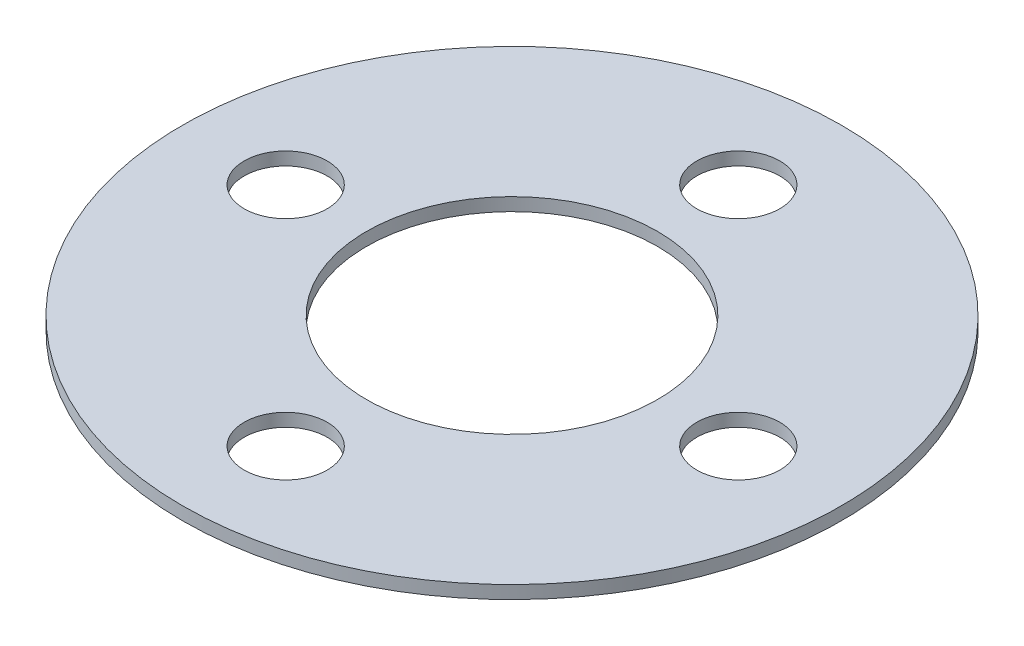
ISO-10303-21;
HEADER;
FILE_DESCRIPTION(('STEP AP214'),'2;1');
FILE_NAME('part.step','',(''),(''),'','','');
FILE_SCHEMA(('AUTOMOTIVE_DESIGN { 1 0 10303 214 1 1 1 1 }'));
ENDSEC;
DATA;
#1=APPLICATION_CONTEXT('core data for automotive mechanical design processes');
#2=APPLICATION_PROTOCOL_DEFINITION('international standard','automotive_design',2000,#1);
#3=PRODUCT_CONTEXT('',#1,'mechanical');
#4=PRODUCT('Part','Part','',(#3));
#5=PRODUCT_RELATED_PRODUCT_CATEGORY('part','',(#4));
#6=PRODUCT_DEFINITION_FORMATION('','',#4);
#7=PRODUCT_DEFINITION_CONTEXT('part definition',#1,'design');
#8=PRODUCT_DEFINITION('design','',#6,#7);
#9=PRODUCT_DEFINITION_SHAPE('','',#8);
#10=(LENGTH_UNIT() NAMED_UNIT(*) SI_UNIT(.MILLI.,.METRE.));
#11=(NAMED_UNIT(*) PLANE_ANGLE_UNIT() SI_UNIT($,.RADIAN.));
#12=(NAMED_UNIT(*) SI_UNIT($,.STERADIAN.) SOLID_ANGLE_UNIT());
#13=UNCERTAINTY_MEASURE_WITH_UNIT(LENGTH_MEASURE(1.E-05),#10,'distance_accuracy_value','');
#14=(GEOMETRIC_REPRESENTATION_CONTEXT(3) GLOBAL_UNCERTAINTY_ASSIGNED_CONTEXT((#13)) GLOBAL_UNIT_ASSIGNED_CONTEXT((#10,
#11,#12)) REPRESENTATION_CONTEXT('',''));
#15=CARTESIAN_POINT('',(0.,0.,0.));
#16=DIRECTION('',(0.,0.,1.));
#17=DIRECTION('',(1.,0.,0.));
#18=AXIS2_PLACEMENT_3D('',#15,#16,#17);
#19=CARTESIAN_POINT('',(0.,0.8636,0.));
#20=DIRECTION('',(0.,1.,0.));
#21=DIRECTION('',(0.,0.,1.));
#22=AXIS2_PLACEMENT_3D('',#19,#20,#21);
#23=PLANE('',#22);
#24=CARTESIAN_POINT('',(0.,0.8636,0.));
#25=DIRECTION('',(0.,-1.,0.));
#26=DIRECTION('',(0.,0.,-1.));
#27=AXIS2_PLACEMENT_3D('',#24,#25,#26);
#28=CIRCLE('',#27,9.652);
#29=CARTESIAN_POINT('',(0.,0.8636,-9.652));
#30=VERTEX_POINT('',#29);
#31=EDGE_CURVE('E83',#30,#30,#28,.T.);
#32=ORIENTED_EDGE('',*,*,#31,.T.);
#33=EDGE_LOOP('',(#32));
#34=FACE_BOUND('',#33,.T.);
#35=CARTESIAN_POINT('',(8.47140372315957E-13,0.8636,15.));
#36=DIRECTION('',(0.,1.,0.));
#37=DIRECTION('',(0.,0.,1.));
#38=AXIS2_PLACEMENT_3D('',#35,#36,#37);
#39=CIRCLE('',#38,2.75000000000091);
#40=CARTESIAN_POINT('',(8.47140372315957E-13,0.8636,17.7500000000009));
#41=VERTEX_POINT('',#40);
#42=EDGE_CURVE('E67',#41,#41,#39,.T.);
#43=ORIENTED_EDGE('',*,*,#42,.F.);
#44=EDGE_LOOP('',(#43));
#45=FACE_BOUND('',#44,.T.);
#46=CARTESIAN_POINT('',(0.,0.8636,-15.));
#47=DIRECTION('',(0.,1.,0.));
#48=DIRECTION('',(0.,0.,1.));
#49=AXIS2_PLACEMENT_3D('',#46,#47,#48);
#50=CIRCLE('',#49,2.75);
#51=CARTESIAN_POINT('',(0.,0.8636,-12.25));
#52=VERTEX_POINT('',#51);
#53=EDGE_CURVE('E53',#52,#52,#50,.T.);
#54=ORIENTED_EDGE('',*,*,#53,.F.);
#55=EDGE_LOOP('',(#54));
#56=FACE_BOUND('',#55,.T.);
#57=CARTESIAN_POINT('',(0.,0.8636,0.));
#58=DIRECTION('',(0.,1.,0.));
#59=DIRECTION('',(0.,0.,1.));
#60=AXIS2_PLACEMENT_3D('',#57,#58,#59);
#61=CIRCLE('',#60,21.844);
#62=CARTESIAN_POINT('',(0.,0.8636,21.844));
#63=VERTEX_POINT('',#62);
#64=EDGE_CURVE('E10',#63,#63,#61,.T.);
#65=ORIENTED_EDGE('',*,*,#64,.T.);
#66=EDGE_LOOP('',(#65));
#67=FACE_BOUND('',#66,.T.);
#68=CARTESIAN_POINT('',(15.0000000000004,0.8636,-4.23570186157979E-13));
#69=DIRECTION('',(0.,1.,0.));
#70=DIRECTION('',(0.,0.,1.));
#71=AXIS2_PLACEMENT_3D('',#68,#69,#70);
#72=CIRCLE('',#71,2.75000000000033);
#73=CARTESIAN_POINT('',(15.0000000000004,0.8636,2.74999999999991));
#74=VERTEX_POINT('',#73);
#75=EDGE_CURVE('E59',#74,#74,#72,.T.);
#76=ORIENTED_EDGE('',*,*,#75,.F.);
#77=EDGE_LOOP('',(#76));
#78=FACE_BOUND('',#77,.T.);
#79=CARTESIAN_POINT('',(-14.9999999999996,0.8636,4.254071563567E-13));
#80=DIRECTION('',(0.,1.,0.));
#81=DIRECTION('',(0.,0.,1.));
#82=AXIS2_PLACEMENT_3D('',#79,#80,#81);
#83=CIRCLE('',#82,2.75000000000068);
#84=CARTESIAN_POINT('',(-14.9999999999996,0.8636,2.75000000000111));
#85=VERTEX_POINT('',#84);
#86=EDGE_CURVE('E75',#85,#85,#83,.T.);
#87=ORIENTED_EDGE('',*,*,#86,.F.);
#88=EDGE_LOOP('',(#87));
#89=FACE_BOUND('',#88,.T.);
#90=ADVANCED_FACE('F40',(#34,#45,#56,#67,#78,#89),#23,.T.);
#91=CARTESIAN_POINT('',(0.,0.,0.));
#92=DIRECTION('',(0.,1.,0.));
#93=DIRECTION('',(0.,0.,1.));
#94=AXIS2_PLACEMENT_3D('',#91,#92,#93);
#95=PLANE('',#94);
#96=CARTESIAN_POINT('',(0.,0.,0.));
#97=DIRECTION('',(0.,-1.,0.));
#98=DIRECTION('',(0.,0.,-1.));
#99=AXIS2_PLACEMENT_3D('',#96,#97,#98);
#100=CIRCLE('',#99,9.652);
#101=CARTESIAN_POINT('',(0.,0.,-9.652));
#102=VERTEX_POINT('',#101);
#103=EDGE_CURVE('E87',#102,#102,#100,.T.);
#104=ORIENTED_EDGE('',*,*,#103,.F.);
#105=EDGE_LOOP('',(#104));
#106=FACE_BOUND('',#105,.T.);
#107=CARTESIAN_POINT('',(0.,0.,0.));
#108=DIRECTION('',(0.,1.,0.));
#109=DIRECTION('',(0.,0.,1.));
#110=AXIS2_PLACEMENT_3D('',#107,#108,#109);
#111=CIRCLE('',#110,21.844);
#112=CARTESIAN_POINT('',(0.,0.,21.844));
#113=VERTEX_POINT('',#112);
#114=EDGE_CURVE('E44',#113,#113,#111,.T.);
#115=ORIENTED_EDGE('',*,*,#114,.F.);
#116=EDGE_LOOP('',(#115));
#117=FACE_BOUND('',#116,.T.);
#118=CARTESIAN_POINT('',(0.,0.,-15.));
#119=DIRECTION('',(0.,1.,0.));
#120=DIRECTION('',(0.,0.,1.));
#121=AXIS2_PLACEMENT_3D('',#118,#119,#120);
#122=CIRCLE('',#121,2.75);
#123=CARTESIAN_POINT('',(0.,0.,-12.25));
#124=VERTEX_POINT('',#123);
#125=EDGE_CURVE('E55',#124,#124,#122,.T.);
#126=ORIENTED_EDGE('',*,*,#125,.T.);
#127=EDGE_LOOP('',(#126));
#128=FACE_BOUND('',#127,.T.);
#129=CARTESIAN_POINT('',(15.0000000000004,0.,-4.23570186157979E-13));
#130=DIRECTION('',(0.,1.,0.));
#131=DIRECTION('',(0.,0.,1.));
#132=AXIS2_PLACEMENT_3D('',#129,#130,#131);
#133=CIRCLE('',#132,2.75000000000033);
#134=CARTESIAN_POINT('',(15.0000000000004,0.,2.74999999999991));
#135=VERTEX_POINT('',#134);
#136=EDGE_CURVE('E63',#135,#135,#133,.T.);
#137=ORIENTED_EDGE('',*,*,#136,.T.);
#138=EDGE_LOOP('',(#137));
#139=FACE_BOUND('',#138,.T.);
#140=CARTESIAN_POINT('',(8.47140372315957E-13,0.,15.));
#141=DIRECTION('',(0.,1.,0.));
#142=DIRECTION('',(0.,0.,1.));
#143=AXIS2_PLACEMENT_3D('',#140,#141,#142);
#144=CIRCLE('',#143,2.75000000000091);
#145=CARTESIAN_POINT('',(8.47140372315957E-13,0.,17.7500000000009));
#146=VERTEX_POINT('',#145);
#147=EDGE_CURVE('E71',#146,#146,#144,.T.);
#148=ORIENTED_EDGE('',*,*,#147,.T.);
#149=EDGE_LOOP('',(#148));
#150=FACE_BOUND('',#149,.T.);
#151=CARTESIAN_POINT('',(-14.9999999999996,0.,4.254071563567E-13));
#152=DIRECTION('',(0.,1.,0.));
#153=DIRECTION('',(0.,0.,1.));
#154=AXIS2_PLACEMENT_3D('',#151,#152,#153);
#155=CIRCLE('',#154,2.75000000000068);
#156=CARTESIAN_POINT('',(-14.9999999999996,0.,2.75000000000111));
#157=VERTEX_POINT('',#156);
#158=EDGE_CURVE('E79',#157,#157,#155,.T.);
#159=ORIENTED_EDGE('',*,*,#158,.T.);
#160=EDGE_LOOP('',(#159));
#161=FACE_BOUND('',#160,.T.);
#162=ADVANCED_FACE('F104',(#106,#117,#128,#139,#150,#161),#95,.F.);
#163=CARTESIAN_POINT('',(0.,0.8636,0.));
#164=DIRECTION('',(0.,-1.,0.));
#165=DIRECTION('',(0.,0.,-1.));
#166=AXIS2_PLACEMENT_3D('',#163,#164,#165);
#167=CYLINDRICAL_SURFACE('',#166,21.844);
#168=ORIENTED_EDGE('',*,*,#64,.F.);
#169=EDGE_LOOP('',(#168));
#170=FACE_BOUND('',#169,.T.);
#171=ORIENTED_EDGE('',*,*,#114,.T.);
#172=EDGE_LOOP('',(#171));
#173=FACE_BOUND('',#172,.T.);
#174=ADVANCED_FACE('F42',(#170,#173),#167,.T.);
#175=CARTESIAN_POINT('',(0.,0.8636,-15.));
#176=DIRECTION('',(0.,-1.,0.));
#177=DIRECTION('',(0.,0.,-1.));
#178=AXIS2_PLACEMENT_3D('',#175,#176,#177);
#179=CYLINDRICAL_SURFACE('',#178,2.75);
#180=ORIENTED_EDGE('',*,*,#53,.T.);
#181=EDGE_LOOP('',(#180));
#182=FACE_BOUND('',#181,.T.);
#183=ORIENTED_EDGE('',*,*,#125,.F.);
#184=EDGE_LOOP('',(#183));
#185=FACE_BOUND('',#184,.T.);
#186=ADVANCED_FACE('F132',(#182,#185),#179,.F.);
#187=CARTESIAN_POINT('',(15.0000000000004,0.8636,-4.23570186157979E-13));
#188=DIRECTION('',(0.,-1.,0.));
#189=DIRECTION('',(0.,0.,-1.));
#190=AXIS2_PLACEMENT_3D('',#187,#188,#189);
#191=CYLINDRICAL_SURFACE('',#190,2.75000000000033);
#192=ORIENTED_EDGE('',*,*,#75,.T.);
#193=EDGE_LOOP('',(#192));
#194=FACE_BOUND('',#193,.T.);
#195=ORIENTED_EDGE('',*,*,#136,.F.);
#196=EDGE_LOOP('',(#195));
#197=FACE_BOUND('',#196,.T.);
#198=ADVANCED_FACE('F124',(#194,#197),#191,.F.);
#199=CARTESIAN_POINT('',(8.47140372315957E-13,0.8636,15.));
#200=DIRECTION('',(0.,-1.,0.));
#201=DIRECTION('',(0.,0.,-1.));
#202=AXIS2_PLACEMENT_3D('',#199,#200,#201);
#203=CYLINDRICAL_SURFACE('',#202,2.75000000000091);
#204=ORIENTED_EDGE('',*,*,#42,.T.);
#205=EDGE_LOOP('',(#204));
#206=FACE_BOUND('',#205,.T.);
#207=ORIENTED_EDGE('',*,*,#147,.F.);
#208=EDGE_LOOP('',(#207));
#209=FACE_BOUND('',#208,.T.);
#210=ADVANCED_FACE('F118',(#206,#209),#203,.F.);
#211=CARTESIAN_POINT('',(-14.9999999999996,0.8636,4.254071563567E-13));
#212=DIRECTION('',(0.,-1.,0.));
#213=DIRECTION('',(0.,0.,-1.));
#214=AXIS2_PLACEMENT_3D('',#211,#212,#213);
#215=CYLINDRICAL_SURFACE('',#214,2.75000000000068);
#216=ORIENTED_EDGE('',*,*,#86,.T.);
#217=EDGE_LOOP('',(#216));
#218=FACE_BOUND('',#217,.T.);
#219=ORIENTED_EDGE('',*,*,#158,.F.);
#220=EDGE_LOOP('',(#219));
#221=FACE_BOUND('',#220,.T.);
#222=ADVANCED_FACE('F100',(#218,#221),#215,.F.);
#223=CARTESIAN_POINT('',(0.,0.8636,0.));
#224=DIRECTION('',(0.,-1.,0.));
#225=DIRECTION('',(0.,0.,-1.));
#226=AXIS2_PLACEMENT_3D('',#223,#224,#225);
#227=CYLINDRICAL_SURFACE('',#226,9.652);
#228=ORIENTED_EDGE('',*,*,#31,.F.);
#229=EDGE_LOOP('',(#228));
#230=FACE_BOUND('',#229,.T.);
#231=ORIENTED_EDGE('',*,*,#103,.T.);
#232=EDGE_LOOP('',(#231));
#233=FACE_BOUND('',#232,.T.);
#234=ADVANCED_FACE('F97',(#230,#233),#227,.F.);
#235=CLOSED_SHELL('',(#90,#162,#174,#186,#198,#210,#222,#234));
#236=MANIFOLD_SOLID_BREP('B2',#235);
#237=ADVANCED_BREP_SHAPE_REPRESENTATION('',(#18,#236),#14);
#238=SHAPE_DEFINITION_REPRESENTATION(#9,#237);
ENDSEC;
END-ISO-10303-21;
